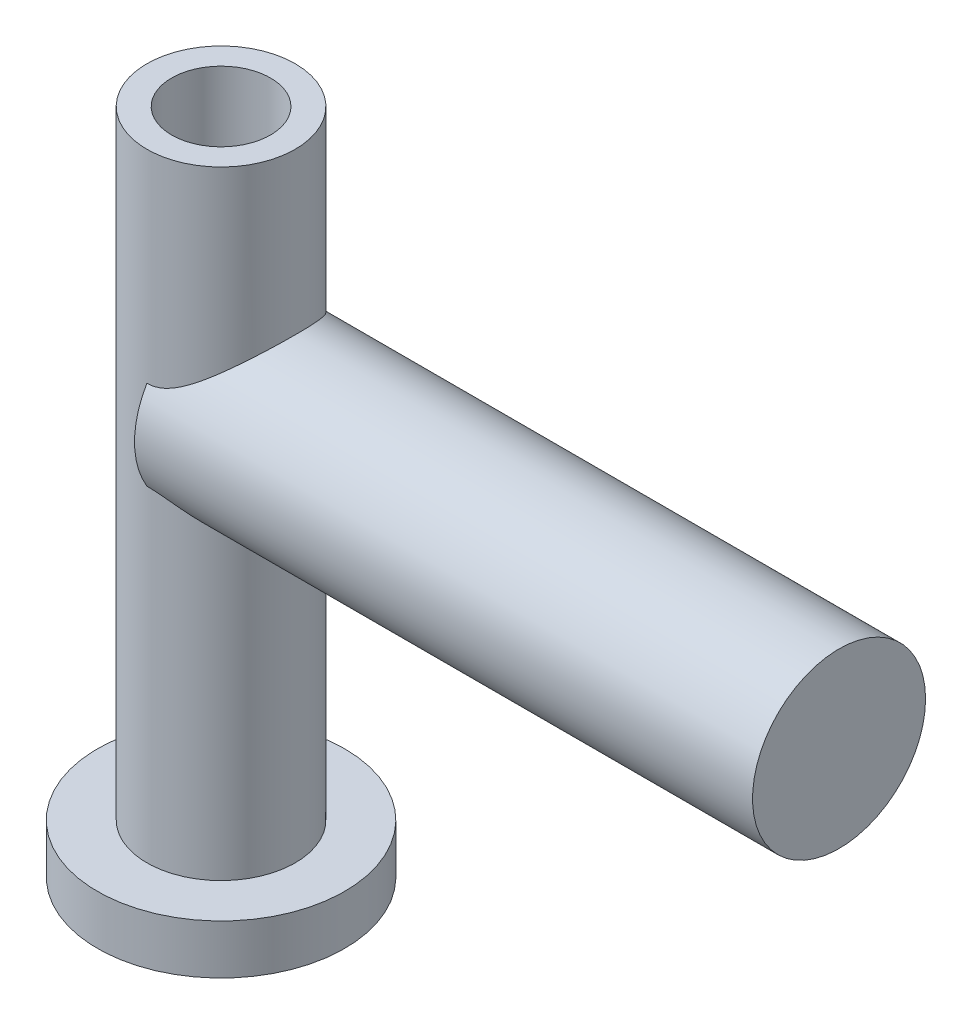
ISO-10303-21;
HEADER;
FILE_DESCRIPTION(('STEP AP214'),'2;1');
FILE_NAME('part.step','',(''),(''),'','','');
FILE_SCHEMA(('AUTOMOTIVE_DESIGN { 1 0 10303 214 1 1 1 1 }'));
ENDSEC;
DATA;
#1=APPLICATION_CONTEXT('core data for automotive mechanical design processes');
#2=APPLICATION_PROTOCOL_DEFINITION('international standard','automotive_design',2000,#1);
#3=PRODUCT_CONTEXT('',#1,'mechanical');
#4=PRODUCT('Part','Part','',(#3));
#5=PRODUCT_RELATED_PRODUCT_CATEGORY('part','',(#4));
#6=PRODUCT_DEFINITION_FORMATION('','',#4);
#7=PRODUCT_DEFINITION_CONTEXT('part definition',#1,'design');
#8=PRODUCT_DEFINITION('design','',#6,#7);
#9=PRODUCT_DEFINITION_SHAPE('','',#8);
#10=(LENGTH_UNIT() NAMED_UNIT(*) SI_UNIT(.MILLI.,.METRE.));
#11=(NAMED_UNIT(*) PLANE_ANGLE_UNIT() SI_UNIT($,.RADIAN.));
#12=(NAMED_UNIT(*) SI_UNIT($,.STERADIAN.) SOLID_ANGLE_UNIT());
#13=UNCERTAINTY_MEASURE_WITH_UNIT(LENGTH_MEASURE(1.E-05),#10,'distance_accuracy_value','');
#14=(GEOMETRIC_REPRESENTATION_CONTEXT(3) GLOBAL_UNCERTAINTY_ASSIGNED_CONTEXT((#13)) GLOBAL_UNIT_ASSIGNED_CONTEXT((#10,
#11,#12)) REPRESENTATION_CONTEXT('',''));
#15=CARTESIAN_POINT('',(0.,0.,0.));
#16=DIRECTION('',(0.,0.,1.));
#17=DIRECTION('',(1.,0.,0.));
#18=AXIS2_PLACEMENT_3D('',#15,#16,#17);
#19=CARTESIAN_POINT('',(0.,0.,0.));
#20=DIRECTION('',(0.,-1.,0.));
#21=DIRECTION('',(0.,0.,-1.));
#22=AXIS2_PLACEMENT_3D('',#19,#20,#21);
#23=CYLINDRICAL_SURFACE('',#22,30.);
#24=CARTESIAN_POINT('',(0.,270.,0.));
#25=DIRECTION('',(0.,-1.,0.));
#26=DIRECTION('',(0.,0.,-1.));
#27=AXIS2_PLACEMENT_3D('',#24,#25,#26);
#28=CIRCLE('',#27,30.);
#29=CARTESIAN_POINT('',(0.,270.,-30.));
#30=VERTEX_POINT('',#29);
#31=EDGE_CURVE('E149',#30,#30,#28,.T.);
#32=ORIENTED_EDGE('',*,*,#31,.T.);
#33=EDGE_LOOP('',(#32));
#34=FACE_BOUND('',#33,.T.);
#35=CARTESIAN_POINT('',(0.,20.,0.));
#36=DIRECTION('',(0.,-1.,0.));
#37=DIRECTION('',(0.,0.,-1.));
#38=AXIS2_PLACEMENT_3D('',#35,#36,#37);
#39=CIRCLE('',#38,30.);
#40=CARTESIAN_POINT('',(0.,20.,-30.));
#41=VERTEX_POINT('',#40);
#42=EDGE_CURVE('E152',#41,#41,#39,.T.);
#43=ORIENTED_EDGE('',*,*,#42,.F.);
#44=EDGE_LOOP('',(#43));
#45=FACE_BOUND('',#44,.T.);
#46=CARTESIAN_POINT('',(0.,151.97224362268,-30.));
#47=CARTESIAN_POINT('',(0.254843531044261,151.97227144705,-30.0000085070818));
#48=CARTESIAN_POINT('',(0.509676547671213,151.966840574093,-29.9967529791874));
#49=CARTESIAN_POINT('',(1.01868418624148,151.945268290933,-29.9837781414388));
#50=CARTESIAN_POINT('',(1.27285890777246,151.92912860883,-29.9740598744879));
#51=CARTESIAN_POINT('',(1.77946381974429,151.88639026993,-29.9482508797766));
#52=CARTESIAN_POINT('',(2.03189654982501,151.85981360213,-29.9321735490007));
#53=CARTESIAN_POINT('',(2.53500628157638,151.796595470609,-29.8937689720393));
#54=CARTESIAN_POINT('',(2.78568322697464,151.759953685803,-29.8714415264704));
#55=CARTESIAN_POINT('',(3.52646289702337,151.636948835995,-29.7961005029997));
#56=CARTESIAN_POINT('',(4.01346160258732,151.536787893146,-29.7343029722881));
#57=CARTESIAN_POINT('',(4.97628277782046,151.303886178219,-29.5884118712677));
#58=CARTESIAN_POINT('',(5.45209827775915,151.171125649653,-29.5043047780959));
#59=CARTESIAN_POINT('',(6.59194195786549,150.815423948069,-29.2747991649152));
#60=CARTESIAN_POINT('',(7.24934601732065,150.578206923666,-29.1185758366101));
#61=CARTESIAN_POINT('',(8.53670604785337,150.061922151294,-28.7675240552719));
#62=CARTESIAN_POINT('',(9.16664964869493,149.782835788623,-28.5726784186936));
#63=CARTESIAN_POINT('',(10.4050977924853,149.192131886346,-28.1454556592297));
#64=CARTESIAN_POINT('',(11.013368111416,148.880252429234,-27.9127667352185));
#65=CARTESIAN_POINT('',(12.2040467749242,148.235620506901,-27.4131010482928));
#66=CARTESIAN_POINT('',(12.7864561596239,147.902868882458,-27.1461256660575));
#67=CARTESIAN_POINT('',(13.7894395728221,147.3057717829,-26.6474181948814));
#68=CARTESIAN_POINT('',(14.2152113646829,147.044249667612,-26.4226810871857));
#69=CARTESIAN_POINT('',(15.0531473959005,146.516146280067,-25.9544434565541));
#70=CARTESIAN_POINT('',(15.4653103899295,146.249564548304,-25.7109412231999));
#71=CARTESIAN_POINT('',(16.2764283315277,145.713595661194,-25.2052843140872));
#72=CARTESIAN_POINT('',(16.6753783076769,145.444207498929,-24.9431227319637));
#73=CARTESIAN_POINT('',(17.4600324905541,144.904747493023,-24.4003036755151));
#74=CARTESIAN_POINT('',(17.8457354564747,144.634675587869,-24.1196444757221));
#75=CARTESIAN_POINT('',(18.981010309238,143.827591609896,-23.2514083415011));
#76=CARTESIAN_POINT('',(19.7109381394293,143.292243491315,-22.6362069589));
#77=CARTESIAN_POINT('',(21.1153264403236,142.239565066678,-21.3321466709155));
#78=CARTESIAN_POINT('',(21.7898099054407,141.722227343025,-20.6433185761379));
#79=CARTESIAN_POINT('',(22.9354367604098,140.829191817946,-19.3529182931282));
#80=CARTESIAN_POINT('',(23.4184587910875,140.447566218951,-18.7659725985148));
#81=CARTESIAN_POINT('',(24.3449221228651,139.708131158864,-17.5473781650169));
#82=CARTESIAN_POINT('',(24.7883646785699,139.350320942955,-16.9157308442399));
#83=CARTESIAN_POINT('',(25.6311292813582,138.664798876577,-15.6092538538373));
#84=CARTESIAN_POINT('',(26.0304987779504,138.337054722128,-14.934471884703));
#85=CARTESIAN_POINT('',(26.780879390746,137.717330384646,-13.5428583282771));
#86=CARTESIAN_POINT('',(27.1318998525571,137.425343291178,-12.8260349056736));
#87=CARTESIAN_POINT('',(27.721630428329,136.93237823708,-11.486747747168));
#88=CARTESIAN_POINT('',(27.9691677420232,136.72449459852,-10.8707020744824));
#89=CARTESIAN_POINT('',(28.4253577124856,136.340144782134,-9.61484157940484));
#90=CARTESIAN_POINT('',(28.6340145430345,136.163675232129,-8.97502931718643));
#91=CARTESIAN_POINT('',(29.009485500897,135.84534671096,-7.67510290547277));
#92=CARTESIAN_POINT('',(29.1763179038312,135.703472623692,-7.01499776521257));
#93=CARTESIAN_POINT('',(29.4656591271574,135.456993167373,-5.67824964814192));
#94=CARTESIAN_POINT('',(29.5881674502048,135.352388216506,-5.00160648585527));
#95=CARTESIAN_POINT('',(29.7872364149821,135.182234910991,-3.63328937606363));
#96=CARTESIAN_POINT('',(29.8635707842187,135.116878904325,-2.94155834786369));
#97=CARTESIAN_POINT('',(29.9679416247089,135.027485123051,-1.55178371127659));
#98=CARTESIAN_POINT('',(29.9959779907175,135.003447438479,-0.853740089137154));
#99=CARTESIAN_POINT('',(30.0032159182894,134.997243495424,0.542725184199511));
#100=CARTESIAN_POINT('',(29.9824216067935,135.015073698463,1.24114679846298));
#101=CARTESIAN_POINT('',(29.8924036182642,135.092189227278,2.63252126579062));
#102=CARTESIAN_POINT('',(29.8231820824126,135.151472720222,3.32547435927246));
#103=CARTESIAN_POINT('',(29.6447875056796,135.304013550973,4.64719380166901));
#104=CARTESIAN_POINT('',(29.5391132397214,135.394293110525,5.27678381196605));
#105=CARTESIAN_POINT('',(29.2892332874525,135.607342016665,6.52260790460563));
#106=CARTESIAN_POINT('',(29.1450300356091,135.730109310498,7.13884282813523));
#107=CARTESIAN_POINT('',(28.8200664373817,136.006046605658,8.35462647132853));
#108=CARTESIAN_POINT('',(28.6393039725067,136.159218368818,8.95417422173183));
#109=CARTESIAN_POINT('',(28.243463736127,136.493552570181,10.1337994217654));
#110=CARTESIAN_POINT('',(28.0283838302646,136.674716749337,10.7138756576559));
#111=CARTESIAN_POINT('',(27.5486587875982,137.077207257773,11.8957356673395));
#112=CARTESIAN_POINT('',(27.2814862375128,137.30054156873,12.4958077943723));
#113=CARTESIAN_POINT('',(26.7130525650811,137.773267872265,13.668858828762));
#114=CARTESIAN_POINT('',(26.4117906408154,138.022660477829,14.2418370983126));
#115=CARTESIAN_POINT('',(25.7778033901022,138.544274601759,15.3596202142414));
#116=CARTESIAN_POINT('',(25.4450633470029,138.816506791291,15.9044116967744));
#117=CARTESIAN_POINT('',(24.7506812765954,139.380477276575,16.9648326162562));
#118=CARTESIAN_POINT('',(24.3890333952218,139.672219521303,17.4804561101704));
#119=CARTESIAN_POINT('',(23.73225145794,140.197464275573,18.3575971183513));
#120=CARTESIAN_POINT('',(23.4428978282461,140.42744159321,18.7255902152965));
#121=CARTESIAN_POINT('',(22.8500082202972,140.895193517089,19.4446449109201));
#122=CARTESIAN_POINT('',(22.5464745463999,141.132966854564,19.795709241929));
#123=CARTESIAN_POINT('',(21.6152824212986,141.856315090443,20.8239094432575));
#124=CARTESIAN_POINT('',(20.9671981872823,142.351785145273,21.4758328132063));
#125=CARTESIAN_POINT('',(19.6196421938525,143.359250871286,22.7136273957622));
#126=CARTESIAN_POINT('',(18.9200617156108,143.871280146774,23.2993518370874));
#127=CARTESIAN_POINT('',(17.4728013316755,144.899426658888,24.4034732282811));
#128=CARTESIAN_POINT('',(16.7251362071827,145.415542596903,24.9218907217498));
#129=CARTESIAN_POINT('',(15.3419904650661,146.332141995921,25.7903898466072));
#130=CARTESIAN_POINT('',(14.7155162376558,146.734350869259,26.1530580020466));
#131=CARTESIAN_POINT('',(13.4308563925657,147.52487637542,26.8354474291592));
#132=CARTESIAN_POINT('',(12.7726656125418,147.913190728656,27.1551616771419));
#133=CARTESIAN_POINT('',(11.4243747193045,148.664502098438,27.7493303175957));
#134=CARTESIAN_POINT('',(10.7343501954096,149.027554424755,28.0238855055936));
#135=CARTESIAN_POINT('',(9.31904267049941,149.715463558128,28.5257514096352));
#136=CARTESIAN_POINT('',(8.59378388602426,150.040346088709,28.7530940235809));
#137=CARTESIAN_POINT('',(7.39034407545813,150.520786520038,29.0793713828421));
#138=CARTESIAN_POINT('',(6.92337281983995,150.693679643673,29.1942183946082));
#139=CARTESIAN_POINT('',(5.97567424531215,151.012908191845,29.4028343026628));
#140=CARTESIAN_POINT('',(5.49494645574708,151.159242706465,29.4966024768018));
#141=CARTESIAN_POINT('',(4.52278709658421,151.419440086846,29.6611951339551));
#142=CARTESIAN_POINT('',(4.03140147819819,151.533420579166,29.7321028597308));
#143=CARTESIAN_POINT('',(3.03882485368801,151.724395219585,29.8498734418044));
#144=CARTESIAN_POINT('',(2.53764060641171,151.801413987015,29.8967523045807));
#145=CARTESIAN_POINT('',(1.69663517245537,151.895674549973,29.9538874329307));
#146=CARTESIAN_POINT('',(1.35852472909171,151.924275030662,29.9711365276115));
#147=CARTESIAN_POINT('',(0.68030244880947,151.962613586752,29.9942133430267));
#148=CARTESIAN_POINT('',(0.340188254617552,151.972320980721,30.0000224860291));
#149=CARTESIAN_POINT('',(0.,151.97224362268,30.));
#150=B_SPLINE_CURVE_WITH_KNOTS('',3,(#46,#47,#48,#49,#50,#51,#52,#53,#54,#55,#56,#57,#58,#59,
#60,#61,#62,#63,#64,#65,#66,#67,#68,#69,#70,#71,#72,#73,#74,#75,#76,#77,#78,#79,#80,#81,#82,#83,
#84,#85,#86,#87,#88,#89,#90,#91,#92,#93,#94,#95,#96,#97,#98,#99,#100,#101,#102,#103,#104,#105,
#106,#107,#108,#109,#110,#111,#112,#113,#114,#115,#116,#117,#118,#119,#120,#121,#122,#123,#124,
#125,#126,#127,#128,#129,#130,#131,#132,#133,#134,#135,#136,#137,#138,#139,#140,#141,#142,#143,
#144,#145,#146,#147,#148,#149),.UNSPECIFIED.,.F.,.F.,(4,2,2,2,2,2,2,2,2,2,2,2,2,2,2,2,2,2,2,2,2,
2,2,2,2,2,2,2,2,2,2,2,2,2,2,2,2,2,2,2,2,2,2,2,2,2,2,2,2,2,2,4),(0.,0.764434366581872,
1.52874540500381,2.29145473205786,3.05418839288965,4.55517955078983,6.05708261659471,
8.20191919162935,10.3477121817195,12.5121751459236,14.676550976818,16.3197197190176,
17.9630384115914,19.6069685391002,21.2510522309294,24.5303393796746,27.8082595766874,
30.3577456825969,32.9071509452256,35.4537841493176,37.9999244100678,40.0850080617103,
42.1698677526064,44.2538148481554,46.3377853261924,48.4318871353075,50.5259935076243,
52.6199229022149,54.7137597207747,56.6458709080768,58.5778600431251,60.5099611629361,
62.4421824957742,64.5215690586896,66.6010045473232,68.6814170639521,70.7622519530984,
72.3264307754301,73.8903562858859,77.0191205212336,80.1546909013151,83.2893019732535,
85.7720119485418,88.2551273960887,90.7326229988382,93.2084392634623,94.7404261011708,
96.2724654159116,97.7988613304167,99.3242391326935,100.342829177059,101.36307198533),.UNSPECIFIED.);
#151=CARTESIAN_POINT('',(0.,151.97224362268,-30.));
#152=VERTEX_POINT('',#151);
#153=CARTESIAN_POINT('',(0.,151.97224362268,30.));
#154=VERTEX_POINT('',#153);
#155=EDGE_CURVE('E92',#152,#154,#150,.T.);
#156=ORIENTED_EDGE('',*,*,#155,.T.);
#157=DIRECTION('',(0.,-1.,0.));
#158=VECTOR('',#157,1.);
#159=CARTESIAN_POINT('',(0.,0.,30.));
#160=LINE('',#159,#158);
#161=CARTESIAN_POINT('',(0.,188.02775637732,30.));
#162=VERTEX_POINT('',#161);
#163=EDGE_CURVE('E83',#154,#162,#160,.F.);
#164=ORIENTED_EDGE('',*,*,#163,.T.);
#165=CARTESIAN_POINT('',(0.,188.02775637732,30.));
#166=CARTESIAN_POINT('',(0.254843531044261,188.02772855295,30.0000085070818));
#167=CARTESIAN_POINT('',(0.509676547671213,188.033159425907,29.9967529791874));
#168=CARTESIAN_POINT('',(1.01868418624148,188.054731709067,29.9837781414388));
#169=CARTESIAN_POINT('',(1.27285890777246,188.07087139117,29.9740598744879));
#170=CARTESIAN_POINT('',(1.77946381974429,188.11360973007,29.9482508797766));
#171=CARTESIAN_POINT('',(2.03189654982501,188.14018639787,29.9321735490007));
#172=CARTESIAN_POINT('',(2.53500628157638,188.203404529391,29.8937689720393));
#173=CARTESIAN_POINT('',(2.78568322697464,188.240046314197,29.8714415264704));
#174=CARTESIAN_POINT('',(3.52646289702337,188.363051164005,29.7961005029997));
#175=CARTESIAN_POINT('',(4.01346160258732,188.463212106854,29.7343029722881));
#176=CARTESIAN_POINT('',(4.97628277782046,188.696113821781,29.5884118712677));
#177=CARTESIAN_POINT('',(5.45209827775915,188.828874350347,29.5043047780959));
#178=CARTESIAN_POINT('',(6.59194195786549,189.184576051931,29.2747991649152));
#179=CARTESIAN_POINT('',(7.24934601732065,189.421793076334,29.1185758366101));
#180=CARTESIAN_POINT('',(8.53670604785337,189.938077848706,28.7675240552719));
#181=CARTESIAN_POINT('',(9.16664964869493,190.217164211377,28.5726784186936));
#182=CARTESIAN_POINT('',(10.4050977924853,190.807868113654,28.1454556592297));
#183=CARTESIAN_POINT('',(11.013368111416,191.119747570766,27.9127667352185));
#184=CARTESIAN_POINT('',(12.2040467749242,191.764379493099,27.4131010482928));
#185=CARTESIAN_POINT('',(12.7864561596239,192.097131117542,27.1461256660575));
#186=CARTESIAN_POINT('',(13.7894395728221,192.6942282171,26.6474181948814));
#187=CARTESIAN_POINT('',(14.2152113646829,192.955750332388,26.4226810871857));
#188=CARTESIAN_POINT('',(15.0531473959005,193.483853719933,25.9544434565541));
#189=CARTESIAN_POINT('',(15.4653103899295,193.750435451696,25.7109412231999));
#190=CARTESIAN_POINT('',(16.2764283315277,194.286404338806,25.2052843140872));
#191=CARTESIAN_POINT('',(16.6753783076769,194.555792501071,24.9431227319638));
#192=CARTESIAN_POINT('',(17.4600324905541,195.095252506977,24.4003036755151));
#193=CARTESIAN_POINT('',(17.8457354564747,195.365324412131,24.1196444757221));
#194=CARTESIAN_POINT('',(18.981010309238,196.172408390104,23.2514083415011));
#195=CARTESIAN_POINT('',(19.7109381394293,196.707756508685,22.6362069589));
#196=CARTESIAN_POINT('',(21.1153264403236,197.760434933322,21.3321466709155));
#197=CARTESIAN_POINT('',(21.7898099054407,198.277772656975,20.6433185761379));
#198=CARTESIAN_POINT('',(22.9354367604098,199.170808182054,19.3529182931282));
#199=CARTESIAN_POINT('',(23.4184587910875,199.552433781049,18.7659725985148));
#200=CARTESIAN_POINT('',(24.3449221228651,200.291868841136,17.5473781650169));
#201=CARTESIAN_POINT('',(24.7883646785699,200.649679057045,16.9157308442399));
#202=CARTESIAN_POINT('',(25.6311292813582,201.335201123423,15.6092538538373));
#203=CARTESIAN_POINT('',(26.0304987779504,201.662945277872,14.934471884703));
#204=CARTESIAN_POINT('',(26.780879390746,202.282669615354,13.5428583282771));
#205=CARTESIAN_POINT('',(27.1318998525571,202.574656708822,12.8260349056736));
#206=CARTESIAN_POINT('',(27.721630428329,203.06762176292,11.486747747168));
#207=CARTESIAN_POINT('',(27.9691677420232,203.27550540148,10.8707020744824));
#208=CARTESIAN_POINT('',(28.4253577124856,203.659855217866,9.61484157940484));
#209=CARTESIAN_POINT('',(28.6340145430345,203.836324767871,8.97502931718643));
#210=CARTESIAN_POINT('',(29.009485500897,204.15465328904,7.67510290547276));
#211=CARTESIAN_POINT('',(29.1763179038312,204.296527376308,7.01499776521256));
#212=CARTESIAN_POINT('',(29.4656591271574,204.543006832627,5.67824964814191));
#213=CARTESIAN_POINT('',(29.5881674502048,204.647611783494,5.00160648585526));
#214=CARTESIAN_POINT('',(29.7872364149821,204.817765089009,3.63328937606363));
#215=CARTESIAN_POINT('',(29.8635707842187,204.883121095675,2.94155834786369));
#216=CARTESIAN_POINT('',(29.9679416247089,204.972514876949,1.55178371127659));
#217=CARTESIAN_POINT('',(29.9959779907175,204.996552561521,0.853740089137154));
#218=CARTESIAN_POINT('',(30.0032159182894,205.002756504576,-0.542725184199511));
#219=CARTESIAN_POINT('',(29.9824216067935,204.984926301537,-1.24114679846298));
#220=CARTESIAN_POINT('',(29.8924036182642,204.907810772722,-2.63252126579062));
#221=CARTESIAN_POINT('',(29.8231820824126,204.848527279778,-3.32547435927246));
#222=CARTESIAN_POINT('',(29.6447875056796,204.695986449028,-4.64719380166901));
#223=CARTESIAN_POINT('',(29.5391132397214,204.605706889475,-5.27678381196605));
#224=CARTESIAN_POINT('',(29.2892332874525,204.392657983335,-6.52260790460563));
#225=CARTESIAN_POINT('',(29.1450300356091,204.269890689502,-7.13884282813523));
#226=CARTESIAN_POINT('',(28.8200664373817,203.993953394342,-8.35462647132853));
#227=CARTESIAN_POINT('',(28.6393039725067,203.840781631182,-8.95417422173182));
#228=CARTESIAN_POINT('',(28.243463736127,203.506447429819,-10.1337994217654));
#229=CARTESIAN_POINT('',(28.0283838302646,203.325283250663,-10.7138756576559));
#230=CARTESIAN_POINT('',(27.5486587875982,202.922792742227,-11.8957356673395));
#231=CARTESIAN_POINT('',(27.2814862375128,202.69945843127,-12.4958077943723));
#232=CARTESIAN_POINT('',(26.7130525650811,202.226732127735,-13.668858828762));
#233=CARTESIAN_POINT('',(26.4117906408154,201.977339522171,-14.2418370983126));
#234=CARTESIAN_POINT('',(25.7778033901021,201.455725398241,-15.3596202142414));
#235=CARTESIAN_POINT('',(25.4450633470029,201.183493208709,-15.9044116967744));
#236=CARTESIAN_POINT('',(24.7506812765954,200.619522723425,-16.9648326162562));
#237=CARTESIAN_POINT('',(24.3890333952218,200.327780478697,-17.4804561101704));
#238=CARTESIAN_POINT('',(23.73225145794,199.802535724427,-18.3575971183513));
#239=CARTESIAN_POINT('',(23.4428978282461,199.57255840679,-18.7255902152965));
#240=CARTESIAN_POINT('',(22.8500082202972,199.104806482911,-19.4446449109201));
#241=CARTESIAN_POINT('',(22.5464745463999,198.867033145436,-19.795709241929));
#242=CARTESIAN_POINT('',(21.6152824212986,198.143684909557,-20.8239094432575));
#243=CARTESIAN_POINT('',(20.9671981872823,197.648214854727,-21.4758328132063));
#244=CARTESIAN_POINT('',(19.6196421938525,196.640749128714,-22.7136273957622));
#245=CARTESIAN_POINT('',(18.9200617156108,196.128719853226,-23.2993518370874));
#246=CARTESIAN_POINT('',(17.4728013316755,195.100573341112,-24.4034732282811));
#247=CARTESIAN_POINT('',(16.7251362071827,194.584457403097,-24.9218907217498));
#248=CARTESIAN_POINT('',(15.3419904650661,193.667858004079,-25.7903898466072));
#249=CARTESIAN_POINT('',(14.7155162376558,193.265649130741,-26.1530580020466));
#250=CARTESIAN_POINT('',(13.4308563925657,192.47512362458,-26.8354474291592));
#251=CARTESIAN_POINT('',(12.7726656125418,192.086809271344,-27.1551616771419));
#252=CARTESIAN_POINT('',(11.4243747193044,191.335497901562,-27.7493303175957));
#253=CARTESIAN_POINT('',(10.7343501954096,190.972445575245,-28.0238855055936));
#254=CARTESIAN_POINT('',(9.3190426704994,190.284536441872,-28.5257514096352));
#255=CARTESIAN_POINT('',(8.59378388602425,189.959653911291,-28.7530940235809));
#256=CARTESIAN_POINT('',(7.39034407545813,189.479213479962,-29.0793713828421));
#257=CARTESIAN_POINT('',(6.92337281983994,189.306320356327,-29.1942183946082));
#258=CARTESIAN_POINT('',(5.97567424531215,188.987091808155,-29.4028343026628));
#259=CARTESIAN_POINT('',(5.49494645574708,188.840757293535,-29.4966024768018));
#260=CARTESIAN_POINT('',(4.52278709658421,188.580559913154,-29.6611951339551));
#261=CARTESIAN_POINT('',(4.03140147819819,188.466579420834,-29.7321028597308));
#262=CARTESIAN_POINT('',(3.03882485368802,188.275604780415,-29.8498734418044));
#263=CARTESIAN_POINT('',(2.53764060641171,188.198586012985,-29.8967523045807));
#264=CARTESIAN_POINT('',(1.69663517245537,188.104325450027,-29.9538874329307));
#265=CARTESIAN_POINT('',(1.35852472909171,188.075724969338,-29.9711365276115));
#266=CARTESIAN_POINT('',(0.68030244880947,188.037386413248,-29.9942133430267));
#267=CARTESIAN_POINT('',(0.340188254617552,188.027679019279,-30.0000224860291));
#268=CARTESIAN_POINT('',(0.,188.02775637732,-30.));
#269=B_SPLINE_CURVE_WITH_KNOTS('',3,(#165,#166,#167,#168,#169,#170,#171,#172,#173,#174,#175,
#176,#177,#178,#179,#180,#181,#182,#183,#184,#185,#186,#187,#188,#189,#190,#191,#192,#193,#194,
#195,#196,#197,#198,#199,#200,#201,#202,#203,#204,#205,#206,#207,#208,#209,#210,#211,#212,#213,
#214,#215,#216,#217,#218,#219,#220,#221,#222,#223,#224,#225,#226,#227,#228,#229,#230,#231,#232,
#233,#234,#235,#236,#237,#238,#239,#240,#241,#242,#243,#244,#245,#246,#247,#248,#249,#250,#251,
#252,#253,#254,#255,#256,#257,#258,#259,#260,#261,#262,#263,#264,#265,#266,#267,#268),
.UNSPECIFIED.,.F.,.F.,(4,2,2,2,2,2,2,2,2,2,2,2,2,2,2,2,2,2,2,2,2,2,2,2,2,2,2,2,2,2,2,2,2,2,2,2,
2,2,2,2,2,2,2,2,2,2,2,2,2,2,2,4),(0.,0.764434366581872,1.52874540500381,2.29145473205786,
3.05418839288965,4.55517955078983,6.05708261659471,8.20191919162935,10.3477121817195,
12.5121751459236,14.676550976818,16.3197197190176,17.9630384115914,19.6069685391002,
21.2510522309294,24.5303393796746,27.8082595766874,30.3577456825969,32.9071509452256,
35.4537841493176,37.9999244100678,40.0850080617103,42.1698677526064,44.2538148481554,
46.3377853261924,48.4318871353075,50.5259935076243,52.6199229022149,54.7137597207747,
56.6458709080768,58.5778600431251,60.5099611629361,62.4421824957742,64.5215690586895,
66.6010045473232,68.6814170639521,70.7622519530984,72.3264307754301,73.8903562858859,
77.0191205212336,80.1546909013152,83.2893019732536,85.7720119485418,88.2551273960887,
90.7326229988382,93.2084392634623,94.7404261011708,96.2724654159116,97.7988613304168,
99.3242391326935,100.342829177059,101.36307198533),.UNSPECIFIED.);
#270=CARTESIAN_POINT('',(0.,188.02775637732,-30.));
#271=VERTEX_POINT('',#270);
#272=EDGE_CURVE('E90',#162,#271,#269,.T.);
#273=ORIENTED_EDGE('',*,*,#272,.T.);
#274=DIRECTION('',(0.,-1.,0.));
#275=VECTOR('',#274,1.);
#276=CARTESIAN_POINT('',(0.,0.,-30.));
#277=LINE('',#276,#275);
#278=EDGE_CURVE('E78',#271,#152,#277,.T.);
#279=ORIENTED_EDGE('',*,*,#278,.T.);
#280=EDGE_LOOP('',(#156,#164,#273,#279));
#281=FACE_BOUND('',#280,.T.);
#282=ADVANCED_FACE('F41',(#34,#45,#281),#23,.T.);
#283=CARTESIAN_POINT('',(0.,-30.,0.));
#284=DIRECTION('',(0.,1.,0.));
#285=DIRECTION('',(0.,0.,1.));
#286=AXIS2_PLACEMENT_3D('',#283,#284,#285);
#287=CYLINDRICAL_SURFACE('',#286,20.);
#288=CARTESIAN_POINT('',(0.,270.,0.));
#289=DIRECTION('',(0.,1.,0.));
#290=DIRECTION('',(0.,0.,1.));
#291=AXIS2_PLACEMENT_3D('',#288,#289,#290);
#292=CIRCLE('',#291,20.);
#293=CARTESIAN_POINT('',(0.,270.,20.));
#294=VERTEX_POINT('',#293);
#295=EDGE_CURVE('E98',#294,#294,#292,.T.);
#296=ORIENTED_EDGE('',*,*,#295,.T.);
#297=EDGE_LOOP('',(#296));
#298=FACE_BOUND('',#297,.T.);
#299=CARTESIAN_POINT('',(0.,0.,0.));
#300=DIRECTION('',(0.,-1.,0.));
#301=DIRECTION('',(0.,0.,-1.));
#302=AXIS2_PLACEMENT_3D('',#299,#300,#301);
#303=CIRCLE('',#302,20.);
#304=CARTESIAN_POINT('',(0.,0.,-20.));
#305=VERTEX_POINT('',#304);
#306=EDGE_CURVE('E163',#305,#305,#303,.T.);
#307=ORIENTED_EDGE('',*,*,#306,.T.);
#308=EDGE_LOOP('',(#307));
#309=FACE_BOUND('',#308,.T.);
#310=DIRECTION('',(0.,1.,0.));
#311=VECTOR('',#310,1.);
#312=CARTESIAN_POINT('',(0.,-30.,-20.));
#313=LINE('',#312,#311);
#314=CARTESIAN_POINT('',(0.,198.72281323269,-20.));
#315=VERTEX_POINT('',#314);
#316=CARTESIAN_POINT('',(0.,141.27718676731,-20.));
#317=VERTEX_POINT('',#316);
#318=EDGE_CURVE('E11',#315,#317,#313,.F.);
#319=ORIENTED_EDGE('',*,*,#318,.F.);
#320=CARTESIAN_POINT('',(0.,198.72281323269,20.));
#321=CARTESIAN_POINT('',(0.255670279131844,198.722805393412,20.0000026682885));
#322=CARTESIAN_POINT('',(0.511302147499814,198.726228465895,19.9950962608968));
#323=CARTESIAN_POINT('',(1.02199470280027,198.739857178192,19.9755054454755));
#324=CARTESIAN_POINT('',(1.27705542340466,198.750062407005,19.9608216299579));
#325=CARTESIAN_POINT('',(2.04012865314565,198.79070340738,19.9022062013142));
#326=CARTESIAN_POINT('',(2.54659402800453,198.83116483785,19.8437104141257));
#327=CARTESIAN_POINT('',(3.5472364317734,198.93677402441,19.6893800489718));
#328=CARTESIAN_POINT('',(4.0414761662702,199.001739464732,19.5938210849651));
#329=CARTESIAN_POINT('',(5.0181823384815,199.153891493996,19.3667049353561));
#330=CARTESIAN_POINT('',(5.50064673916206,199.241081898229,19.2351415687003));
#331=CARTESIAN_POINT('',(6.44931124239615,199.434308975824,18.9381279590692));
#332=CARTESIAN_POINT('',(6.91555889122135,199.540283798035,18.7727886650861));
#333=CARTESIAN_POINT('',(7.83120188273861,199.767953010584,18.4096406083705));
#334=CARTESIAN_POINT('',(8.28059763302866,199.889647020405,18.2118326315833));
#335=CARTESIAN_POINT('',(9.16164914595226,200.145609053619,17.7849453943264));
#336=CARTESIAN_POINT('',(9.59326944156105,200.2799006147,17.5558072148397));
#337=CARTESIAN_POINT('',(10.4364792969616,200.557512500283,17.0680164544138));
#338=CARTESIAN_POINT('',(10.8480667499687,200.700833770788,16.8093607787477));
#339=CARTESIAN_POINT('',(11.693679674639,201.00920325617,16.2341326934393));
#340=CARTESIAN_POINT('',(12.1252613503099,201.174916982996,15.9143204599539));
#341=CARTESIAN_POINT('',(12.9606768074715,201.509246034911,15.2416694416279));
#342=CARTESIAN_POINT('',(13.364509092445,201.677861515877,14.8888288779988));
#343=CARTESIAN_POINT('',(14.1429183032116,202.014041909273,14.1515126847879));
#344=CARTESIAN_POINT('',(14.5174865730874,202.181606497484,13.7670277637514));
#345=CARTESIAN_POINT('',(15.2354731476609,202.511813663659,12.9679939840767));
#346=CARTESIAN_POINT('',(15.5788900919706,202.674456026462,12.553443813901));
#347=CARTESIAN_POINT('',(16.2637511008381,203.006234068607,11.655001573272));
#348=CARTESIAN_POINT('',(16.6018932670986,203.174513267518,11.1682654778642));
#349=CARTESIAN_POINT('',(17.235587433247,203.496133198118,10.1630471833621));
#350=CARTESIAN_POINT('',(17.5311360061146,203.649472727462,9.64456243459293));
#351=CARTESIAN_POINT('',(18.0763585613556,203.936721642103,8.57922232078269));
#352=CARTESIAN_POINT('',(18.3260598216912,204.070642570925,8.03238407535173));
#353=CARTESIAN_POINT('',(18.7766124139065,204.315089033213,6.91391021522127));
#354=CARTESIAN_POINT('',(18.9774708770118,204.425617981688,6.34227823487545));
#355=CARTESIAN_POINT('',(19.3119097117223,204.611158400549,5.23037094592629));
#356=CARTESIAN_POINT('',(19.4498678889871,204.688445902465,4.69179085405216));
#357=CARTESIAN_POINT('',(19.6808191452771,204.8184650329,3.60214260577134));
#358=CARTESIAN_POINT('',(19.7738146452035,204.87119798349,3.05107512338935));
#359=CARTESIAN_POINT('',(19.9133766546763,204.950526094865,1.94160420335985));
#360=CARTESIAN_POINT('',(19.9599750183818,204.977139188173,1.3832060658335));
#361=CARTESIAN_POINT('',(20.0061004823362,205.00348092149,0.263854675278325));
#362=CARTESIAN_POINT('',(20.0056317355242,205.003211933423,-0.297098347954263));
#363=CARTESIAN_POINT('',(19.9603666131348,204.977363969908,-1.35303780306878));
#364=CARTESIAN_POINT('',(19.9205826982823,204.954647003593,-1.84831913409486));
#365=CARTESIAN_POINT('',(19.8045199178731,204.888633116015,-2.83315735777662));
#366=CARTESIAN_POINT('',(19.7282444446883,204.845338107757,-3.32271477821237));
#367=CARTESIAN_POINT('',(19.5401188526679,204.739174221321,-4.29277233546326));
#368=CARTESIAN_POINT('',(19.4282679007107,204.676304884745,-4.77327225988694));
#369=CARTESIAN_POINT('',(19.170249158164,204.532404965571,-5.7221782239081));
#370=CARTESIAN_POINT('',(19.0240799972792,204.451373657788,-6.19058377975903));
#371=CARTESIAN_POINT('',(18.6974930078216,204.272109000144,-7.11666795912129));
#372=CARTESIAN_POINT('',(18.5167852948616,204.173730639289,-7.57421602280938));
#373=CARTESIAN_POINT('',(18.123647280057,203.962319284941,-8.47192683841094));
#374=CARTESIAN_POINT('',(17.9112171831366,203.849286386115,-8.91208970260822));
#375=CARTESIAN_POINT('',(17.4563058616485,203.610788371649,-9.77315350389956));
#376=CARTESIAN_POINT('',(17.2138200304219,203.485321350816,-10.1940514746823));
#377=CARTESIAN_POINT('',(16.7004739796635,203.224343152947,-11.0149244979189));
#378=CARTESIAN_POINT('',(16.4296109906617,203.088830995933,-11.4148975024776));
#379=CARTESIAN_POINT('',(15.8289637715986,202.794511788258,-12.2364727073304));
#380=CARTESIAN_POINT('',(15.4959799735947,202.634802392823,-12.6554152856254));
#381=CARTESIAN_POINT('',(14.7987941160363,202.309584101631,-13.4640537531067));
#382=CARTESIAN_POINT('',(14.4345899558037,202.144074816069,-13.8537476709678));
#383=CARTESIAN_POINT('',(13.6762435922169,201.810744881596,-14.6029042353293));
#384=CARTESIAN_POINT('',(13.2820623661793,201.642921461076,-14.9623261475165));
#385=CARTESIAN_POINT('',(12.4658066804466,201.30906627914,-15.6489011973619));
#386=CARTESIAN_POINT('',(12.0437311679902,201.14303458562,-15.9760531159519));
#387=CARTESIAN_POINT('',(11.1294640693968,200.800450412139,-16.6277181701676));
#388=CARTESIAN_POINT('',(10.6344882922915,200.624516632265,-16.9486645532875));
#389=CARTESIAN_POINT('',(9.61469029312762,200.285492671768,-17.5472883486441));
#390=CARTESIAN_POINT('',(9.08986352861726,200.122404454921,-17.8249591514224));
#391=CARTESIAN_POINT('',(8.01450726864382,199.815559290252,-18.3335875911257));
#392=CARTESIAN_POINT('',(7.46405481356351,199.67174887795,-18.564675357326));
#393=CARTESIAN_POINT('',(6.33948486174238,199.409023859194,-18.9781307802206));
#394=CARTESIAN_POINT('',(5.76537684092611,199.290099397791,-19.1605177305895));
#395=CARTESIAN_POINT('',(4.76477336674043,199.112445933574,-19.428932097986));
#396=CARTESIAN_POINT('',(4.34295658766529,199.046225820405,-19.5276026133311));
#397=CARTESIAN_POINT('',(3.49160693487979,198.931186899589,-19.6976394440836));
#398=CARTESIAN_POINT('',(3.06207640728424,198.882362892057,-19.769013919042));
#399=CARTESIAN_POINT('',(2.19534579700234,198.803341443525,-19.8839748190351));
#400=CARTESIAN_POINT('',(1.75811809642233,198.773238403453,-19.9274204486391));
#401=CARTESIAN_POINT('',(1.10010178210585,198.743035068064,-19.9709339611602));
#402=CARTESIAN_POINT('',(0.880304423975293,198.735459122399,-19.9818293313504));
#403=CARTESIAN_POINT('',(0.440346109055547,198.725345934936,-19.9963632512298));
#404=CARTESIAN_POINT('',(0.220185138956933,198.72280888186,-20.0000015291165));
#405=CARTESIAN_POINT('',(0.,198.72281323269,-20.));
#406=B_SPLINE_CURVE_WITH_KNOTS('',3,(#320,#321,#322,#323,#324,#325,#326,#327,#328,#329,#330,
#331,#332,#333,#334,#335,#336,#337,#338,#339,#340,#341,#342,#343,#344,#345,#346,#347,#348,#349,
#350,#351,#352,#353,#354,#355,#356,#357,#358,#359,#360,#361,#362,#363,#364,#365,#366,#367,#368,
#369,#370,#371,#372,#373,#374,#375,#376,#377,#378,#379,#380,#381,#382,#383,#384,#385,#386,#387,
#388,#389,#390,#391,#392,#393,#394,#395,#396,#397,#398,#399,#400,#401,#402,#403,#404,#405),
.UNSPECIFIED.,.F.,.F.,(4,2,2,2,2,2,2,2,2,2,2,2,2,2,2,2,2,2,2,2,2,2,2,2,2,2,2,2,2,2,2,2,2,2,2,2,
2,2,2,2,2,2,4),(0.,0.766865302788237,1.53368413766839,3.06564301458102,4.58642165838048,
6.10746154571264,7.62358314120272,9.13966804247419,10.658644318223,12.1777799958028,
13.862489484695,15.5472897583208,17.2325865020782,18.9179568078737,20.7638163619805,
22.6098243485149,24.4547304236815,26.299366973917,27.9809351629512,29.6624128021315,
31.342735217738,33.0229093712038,34.5133201462247,36.0035923948091,37.4938995457899,
38.9842662135305,40.4877394251336,41.9912029248354,43.4948971468295,44.9987382588775,
46.6724361032045,48.3462466516842,50.0222746630431,51.6983659657243,53.5428367628263,
55.387588989574,57.227114239141,59.06590964392,60.3794599653251,61.6926173222597,
63.0123437287974,63.6727820058347,64.3332450180352),.UNSPECIFIED.);
#407=CARTESIAN_POINT('',(0.,198.72281323269,20.));
#408=VERTEX_POINT('',#407);
#409=EDGE_CURVE('E49',#408,#315,#406,.T.);
#410=ORIENTED_EDGE('',*,*,#409,.F.);
#411=DIRECTION('',(0.,1.,0.));
#412=VECTOR('',#411,1.);
#413=CARTESIAN_POINT('',(0.,-30.,20.));
#414=LINE('',#413,#412);
#415=CARTESIAN_POINT('',(0.,141.27718676731,20.));
#416=VERTEX_POINT('',#415);
#417=EDGE_CURVE('E144',#416,#408,#414,.T.);
#418=ORIENTED_EDGE('',*,*,#417,.F.);
#419=CARTESIAN_POINT('',(0.,141.27718676731,-20.));
#420=CARTESIAN_POINT('',(0.255670279131844,141.277194606588,-20.0000026682885));
#421=CARTESIAN_POINT('',(0.511302147499815,141.273771534105,-19.9950962608968));
#422=CARTESIAN_POINT('',(1.02199470280027,141.260142821808,-19.9755054454755));
#423=CARTESIAN_POINT('',(1.27705542340466,141.249937592995,-19.9608216299579));
#424=CARTESIAN_POINT('',(2.04012865314565,141.20929659262,-19.9022062013142));
#425=CARTESIAN_POINT('',(2.54659402800453,141.16883516215,-19.8437104141257));
#426=CARTESIAN_POINT('',(3.5472364317734,141.06322597559,-19.6893800489718));
#427=CARTESIAN_POINT('',(4.04147616627021,140.998260535268,-19.5938210849651));
#428=CARTESIAN_POINT('',(5.01818233848151,140.846108506005,-19.3667049353561));
#429=CARTESIAN_POINT('',(5.50064673916206,140.758918101771,-19.2351415687003));
#430=CARTESIAN_POINT('',(6.44931124239615,140.565691024176,-18.9381279590692));
#431=CARTESIAN_POINT('',(6.91555889122135,140.459716201965,-18.7727886650861));
#432=CARTESIAN_POINT('',(7.8312018827386,140.232046989416,-18.4096406083705));
#433=CARTESIAN_POINT('',(8.28059763302866,140.110352979596,-18.2118326315833));
#434=CARTESIAN_POINT('',(9.16164914595226,139.854390946381,-17.7849453943264));
#435=CARTESIAN_POINT('',(9.59326944156105,139.7200993853,-17.5558072148397));
#436=CARTESIAN_POINT('',(10.4364792969616,139.442487499717,-17.0680164544138));
#437=CARTESIAN_POINT('',(10.8480667499687,139.299166229212,-16.8093607787477));
#438=CARTESIAN_POINT('',(11.693679674639,138.99079674383,-16.2341326934393));
#439=CARTESIAN_POINT('',(12.1252613503099,138.825083017004,-15.9143204599539));
#440=CARTESIAN_POINT('',(12.9606768074715,138.490753965089,-15.2416694416279));
#441=CARTESIAN_POINT('',(13.364509092445,138.322138484123,-14.8888288779988));
#442=CARTESIAN_POINT('',(14.1429183032116,137.985958090727,-14.1515126847879));
#443=CARTESIAN_POINT('',(14.5174865730874,137.818393502516,-13.7670277637514));
#444=CARTESIAN_POINT('',(15.2354731476609,137.488186336341,-12.9679939840767));
#445=CARTESIAN_POINT('',(15.5788900919706,137.325543973538,-12.553443813901));
#446=CARTESIAN_POINT('',(16.2637511008381,136.993765931393,-11.655001573272));
#447=CARTESIAN_POINT('',(16.6018932670986,136.825486732482,-11.1682654778642));
#448=CARTESIAN_POINT('',(17.235587433247,136.503866801882,-10.1630471833621));
#449=CARTESIAN_POINT('',(17.5311360061146,136.350527272538,-9.64456243459293));
#450=CARTESIAN_POINT('',(18.0763585613556,136.063278357897,-8.57922232078269));
#451=CARTESIAN_POINT('',(18.3260598216912,135.929357429075,-8.03238407535173));
#452=CARTESIAN_POINT('',(18.7766124139065,135.684910966787,-6.91391021522127));
#453=CARTESIAN_POINT('',(18.9774708770118,135.574382018312,-6.34227823487545));
#454=CARTESIAN_POINT('',(19.3119097117223,135.388841599451,-5.23037094592629));
#455=CARTESIAN_POINT('',(19.4498678889871,135.311554097535,-4.69179085405216));
#456=CARTESIAN_POINT('',(19.6808191452771,135.181534967101,-3.60214260577134));
#457=CARTESIAN_POINT('',(19.7738146452035,135.12880201651,-3.05107512338935));
#458=CARTESIAN_POINT('',(19.9133766546763,135.049473905135,-1.94160420335985));
#459=CARTESIAN_POINT('',(19.9599750183818,135.022860811827,-1.3832060658335));
#460=CARTESIAN_POINT('',(20.0061004823362,134.99651907851,-0.263854675278325));
#461=CARTESIAN_POINT('',(20.0056317355242,134.996788066577,0.297098347954263));
#462=CARTESIAN_POINT('',(19.9603666131348,135.022636030092,1.35303780306878));
#463=CARTESIAN_POINT('',(19.9205826982823,135.045352996407,1.84831913409487));
#464=CARTESIAN_POINT('',(19.8045199178731,135.111366883985,2.83315735777662));
#465=CARTESIAN_POINT('',(19.7282444446883,135.154661892243,3.32271477821238));
#466=CARTESIAN_POINT('',(19.5401188526679,135.260825778679,4.29277233546326));
#467=CARTESIAN_POINT('',(19.4282679007107,135.323695115255,4.77327225988694));
#468=CARTESIAN_POINT('',(19.170249158164,135.467595034429,5.72217822390809));
#469=CARTESIAN_POINT('',(19.0240799972792,135.548626342212,6.19058377975903));
#470=CARTESIAN_POINT('',(18.6974930078216,135.727890999856,7.11666795912129));
#471=CARTESIAN_POINT('',(18.5167852948616,135.826269360711,7.57421602280938));
#472=CARTESIAN_POINT('',(18.123647280057,136.037680715059,8.47192683841093));
#473=CARTESIAN_POINT('',(17.9112171831366,136.150713613885,8.91208970260822));
#474=CARTESIAN_POINT('',(17.4563058616485,136.389211628351,9.77315350389956));
#475=CARTESIAN_POINT('',(17.2138200304219,136.514678649184,10.1940514746823));
#476=CARTESIAN_POINT('',(16.7004739796635,136.775656847053,11.0149244979189));
#477=CARTESIAN_POINT('',(16.4296109906617,136.911169004067,11.4148975024776));
#478=CARTESIAN_POINT('',(15.8289637715986,137.205488211742,12.2364727073304));
#479=CARTESIAN_POINT('',(15.4959799735947,137.365197607177,12.6554152856254));
#480=CARTESIAN_POINT('',(14.7987941160363,137.690415898369,13.4640537531067));
#481=CARTESIAN_POINT('',(14.4345899558037,137.855925183931,13.8537476709678));
#482=CARTESIAN_POINT('',(13.6762435922169,138.189255118404,14.6029042353293));
#483=CARTESIAN_POINT('',(13.2820623661793,138.357078538924,14.9623261475165));
#484=CARTESIAN_POINT('',(12.4658066804466,138.69093372086,15.6489011973619));
#485=CARTESIAN_POINT('',(12.0437311679902,138.85696541438,15.9760531159519));
#486=CARTESIAN_POINT('',(11.1294640693968,139.199549587861,16.6277181701676));
#487=CARTESIAN_POINT('',(10.6344882922915,139.375483367735,16.9486645532875));
#488=CARTESIAN_POINT('',(9.61469029312762,139.714507328232,17.5472883486441));
#489=CARTESIAN_POINT('',(9.08986352861726,139.877595545079,17.8249591514224));
#490=CARTESIAN_POINT('',(8.01450726864383,140.184440709748,18.3335875911257));
#491=CARTESIAN_POINT('',(7.46405481356352,140.32825112205,18.564675357326));
#492=CARTESIAN_POINT('',(6.33948486174239,140.590976140806,18.9781307802206));
#493=CARTESIAN_POINT('',(5.76537684092611,140.709900602209,19.1605177305895));
#494=CARTESIAN_POINT('',(4.76477336674043,140.887554066426,19.428932097986));
#495=CARTESIAN_POINT('',(4.34295658766529,140.953774179595,19.5276026133311));
#496=CARTESIAN_POINT('',(3.49160693487979,141.068813100411,19.6976394440836));
#497=CARTESIAN_POINT('',(3.06207640728424,141.117637107943,19.769013919042));
#498=CARTESIAN_POINT('',(2.19534579700234,141.196658556475,19.8839748190351));
#499=CARTESIAN_POINT('',(1.75811809642233,141.226761596547,19.9274204486391));
#500=CARTESIAN_POINT('',(1.10010178210584,141.256964931936,19.9709339611602));
#501=CARTESIAN_POINT('',(0.880304423975284,141.264540877601,19.9818293313504));
#502=CARTESIAN_POINT('',(0.440346109055538,141.274654065064,19.9963632512298));
#503=CARTESIAN_POINT('',(0.220185138956929,141.27719111814,20.0000015291165));
#504=CARTESIAN_POINT('',(0.,141.27718676731,20.));
#505=B_SPLINE_CURVE_WITH_KNOTS('',3,(#419,#420,#421,#422,#423,#424,#425,#426,#427,#428,#429,
#430,#431,#432,#433,#434,#435,#436,#437,#438,#439,#440,#441,#442,#443,#444,#445,#446,#447,#448,
#449,#450,#451,#452,#453,#454,#455,#456,#457,#458,#459,#460,#461,#462,#463,#464,#465,#466,#467,
#468,#469,#470,#471,#472,#473,#474,#475,#476,#477,#478,#479,#480,#481,#482,#483,#484,#485,#486,
#487,#488,#489,#490,#491,#492,#493,#494,#495,#496,#497,#498,#499,#500,#501,#502,#503,#504),
.UNSPECIFIED.,.F.,.F.,(4,2,2,2,2,2,2,2,2,2,2,2,2,2,2,2,2,2,2,2,2,2,2,2,2,2,2,2,2,2,2,2,2,2,2,2,
2,2,2,2,2,2,4),(0.,0.766865302788238,1.53368413766839,3.06564301458102,4.58642165838049,
6.10746154571264,7.62358314120271,9.13966804247419,10.658644318223,12.1777799958028,
13.862489484695,15.5472897583208,17.2325865020782,18.9179568078737,20.7638163619805,
22.6098243485149,24.4547304236815,26.299366973917,27.9809351629512,29.6624128021315,
31.342735217738,33.0229093712038,34.5133201462247,36.0035923948091,37.4938995457898,
38.9842662135305,40.4877394251336,41.9912029248354,43.4948971468295,44.9987382588776,
46.6724361032045,48.3462466516842,50.0222746630431,51.6983659657243,53.5428367628263,
55.387588989574,57.227114239141,59.0659096439201,60.3794599653251,61.6926173222597,
63.0123437287974,63.6727820058348,64.3332450180353),.UNSPECIFIED.);
#506=EDGE_CURVE('E129',#317,#416,#505,.T.);
#507=ORIENTED_EDGE('',*,*,#506,.F.);
#508=EDGE_LOOP('',(#319,#410,#418,#507));
#509=FACE_BOUND('',#508,.T.);
#510=ADVANCED_FACE('F123',(#298,#309,#509),#287,.F.);
#511=CARTESIAN_POINT('',(50.,0.,0.));
#512=DIRECTION('',(0.,-1.,0.));
#513=DIRECTION('',(0.,0.,-1.));
#514=AXIS2_PLACEMENT_3D('',#511,#512,#513);
#515=PLANE('',#514);
#516=ORIENTED_EDGE('',*,*,#306,.F.);
#517=EDGE_LOOP('',(#516));
#518=FACE_BOUND('',#517,.T.);
#519=CARTESIAN_POINT('',(0.,0.,0.));
#520=DIRECTION('',(0.,-1.,0.));
#521=DIRECTION('',(0.,0.,-1.));
#522=AXIS2_PLACEMENT_3D('',#519,#520,#521);
#523=CIRCLE('',#522,50.);
#524=CARTESIAN_POINT('',(0.,0.,-50.));
#525=VERTEX_POINT('',#524);
#526=EDGE_CURVE('E160',#525,#525,#523,.T.);
#527=ORIENTED_EDGE('',*,*,#526,.T.);
#528=EDGE_LOOP('',(#527));
#529=FACE_BOUND('',#528,.T.);
#530=ADVANCED_FACE('F43',(#518,#529),#515,.T.);
#531=CARTESIAN_POINT('',(0.,270.,0.));
#532=DIRECTION('',(0.,1.,0.));
#533=DIRECTION('',(0.,0.,1.));
#534=AXIS2_PLACEMENT_3D('',#531,#532,#533);
#535=PLANE('',#534);
#536=ORIENTED_EDGE('',*,*,#295,.F.);
#537=EDGE_LOOP('',(#536));
#538=FACE_BOUND('',#537,.T.);
#539=ORIENTED_EDGE('',*,*,#31,.F.);
#540=EDGE_LOOP('',(#539));
#541=FACE_BOUND('',#540,.T.);
#542=ADVANCED_FACE('F170',(#538,#541),#535,.T.);
#543=CARTESIAN_POINT('',(30.,20.,0.));
#544=DIRECTION('',(0.,1.,0.));
#545=DIRECTION('',(0.,0.,1.));
#546=AXIS2_PLACEMENT_3D('',#543,#544,#545);
#547=PLANE('',#546);
#548=ORIENTED_EDGE('',*,*,#42,.T.);
#549=EDGE_LOOP('',(#548));
#550=FACE_BOUND('',#549,.T.);
#551=CARTESIAN_POINT('',(0.,20.,0.));
#552=DIRECTION('',(0.,-1.,0.));
#553=DIRECTION('',(0.,0.,-1.));
#554=AXIS2_PLACEMENT_3D('',#551,#552,#553);
#555=CIRCLE('',#554,50.);
#556=CARTESIAN_POINT('',(0.,20.,-50.));
#557=VERTEX_POINT('',#556);
#558=EDGE_CURVE('E157',#557,#557,#555,.T.);
#559=ORIENTED_EDGE('',*,*,#558,.F.);
#560=EDGE_LOOP('',(#559));
#561=FACE_BOUND('',#560,.T.);
#562=ADVANCED_FACE('F173',(#550,#561),#547,.T.);
#563=CARTESIAN_POINT('',(0.,0.,0.));
#564=DIRECTION('',(0.,-1.,0.));
#565=DIRECTION('',(0.,0.,-1.));
#566=AXIS2_PLACEMENT_3D('',#563,#564,#565);
#567=CYLINDRICAL_SURFACE('',#566,50.);
#568=ORIENTED_EDGE('',*,*,#558,.T.);
#569=EDGE_LOOP('',(#568));
#570=FACE_BOUND('',#569,.T.);
#571=ORIENTED_EDGE('',*,*,#526,.F.);
#572=EDGE_LOOP('',(#571));
#573=FACE_BOUND('',#572,.T.);
#574=ADVANCED_FACE('F182',(#570,#573),#567,.T.);
#575=CARTESIAN_POINT('',(0.,170.,0.));
#576=DIRECTION('',(1.,0.,0.));
#577=DIRECTION('',(0.,0.,-1.));
#578=AXIS2_PLACEMENT_3D('',#575,#576,#577);
#579=PLANE('',#578);
#580=CARTESIAN_POINT('',(0.,170.,0.));
#581=DIRECTION('',(1.,0.,0.));
#582=DIRECTION('',(0.,0.,-1.));
#583=AXIS2_PLACEMENT_3D('',#580,#581,#582);
#584=CIRCLE('',#583,35.);
#585=EDGE_CURVE('E95',#315,#408,#584,.T.);
#586=ORIENTED_EDGE('',*,*,#585,.F.);
#587=ORIENTED_EDGE('',*,*,#318,.T.);
#588=EDGE_CURVE('E93',#416,#317,#584,.T.);
#589=ORIENTED_EDGE('',*,*,#588,.F.);
#590=ORIENTED_EDGE('',*,*,#417,.T.);
#591=EDGE_LOOP('',(#586,#587,#589,#590));
#592=FACE_BOUND('',#591,.T.);
#593=ADVANCED_FACE('F187',(#592),#579,.F.);
#594=CARTESIAN_POINT('',(250.,170.,0.));
#595=DIRECTION('',(-1.,0.,0.));
#596=DIRECTION('',(0.,0.,1.));
#597=AXIS2_PLACEMENT_3D('',#594,#595,#596);
#598=CYLINDRICAL_SURFACE('',#597,35.);
#599=ORIENTED_EDGE('',*,*,#588,.T.);
#600=ORIENTED_EDGE('',*,*,#506,.T.);
#601=EDGE_LOOP('',(#599,#600));
#602=FACE_BOUND('',#601,.T.);
#603=ADVANCED_FACE('F120',(#602),#598,.T.);
#604=ORIENTED_EDGE('',*,*,#585,.T.);
#605=ORIENTED_EDGE('',*,*,#409,.T.);
#606=EDGE_LOOP('',(#604,#605));
#607=FACE_BOUND('',#606,.T.);
#608=ADVANCED_FACE('F119',(#607),#598,.T.);
#609=ORIENTED_EDGE('',*,*,#278,.F.);
#610=EDGE_CURVE('E55',#152,#271,#584,.T.);
#611=ORIENTED_EDGE('',*,*,#610,.F.);
#612=EDGE_LOOP('',(#609,#611));
#613=FACE_BOUND('',#612,.T.);
#614=ADVANCED_FACE('F79',(#613),#579,.F.);
#615=ORIENTED_EDGE('',*,*,#155,.F.);
#616=ORIENTED_EDGE('',*,*,#610,.T.);
#617=ORIENTED_EDGE('',*,*,#272,.F.);
#618=EDGE_CURVE('E278',#162,#154,#584,.T.);
#619=ORIENTED_EDGE('',*,*,#618,.T.);
#620=EDGE_LOOP('',(#615,#616,#617,#619));
#621=FACE_BOUND('',#620,.T.);
#622=CARTESIAN_POINT('',(250.,170.,0.));
#623=DIRECTION('',(1.,0.,0.));
#624=DIRECTION('',(0.,0.,-1.));
#625=AXIS2_PLACEMENT_3D('',#622,#623,#624);
#626=CIRCLE('',#625,35.);
#627=CARTESIAN_POINT('',(250.,170.,-35.));
#628=VERTEX_POINT('',#627);
#629=EDGE_CURVE('E84',#628,#628,#626,.T.);
#630=ORIENTED_EDGE('',*,*,#629,.F.);
#631=EDGE_LOOP('',(#630));
#632=FACE_BOUND('',#631,.T.);
#633=ADVANCED_FACE('F87',(#621,#632),#598,.T.);
#634=CARTESIAN_POINT('',(250.,170.,0.));
#635=DIRECTION('',(1.,0.,0.));
#636=DIRECTION('',(0.,0.,-1.));
#637=AXIS2_PLACEMENT_3D('',#634,#635,#636);
#638=PLANE('',#637);
#639=ORIENTED_EDGE('',*,*,#629,.T.);
#640=EDGE_LOOP('',(#639));
#641=FACE_BOUND('',#640,.T.);
#642=ADVANCED_FACE('F118',(#641),#638,.T.);
#643=ORIENTED_EDGE('',*,*,#163,.F.);
#644=ORIENTED_EDGE('',*,*,#618,.F.);
#645=EDGE_LOOP('',(#643,#644));
#646=FACE_BOUND('',#645,.T.);
#647=ADVANCED_FACE('F121',(#646),#579,.F.);
#648=CLOSED_SHELL('',(#282,#510,#530,#542,#562,#574,#593,#603,#608,#614,#633,#642,#647));
#649=MANIFOLD_SOLID_BREP('B2',#648);
#650=ADVANCED_BREP_SHAPE_REPRESENTATION('',(#18,#649),#14);
#651=SHAPE_DEFINITION_REPRESENTATION(#9,#650);
ENDSEC;
END-ISO-10303-21;
